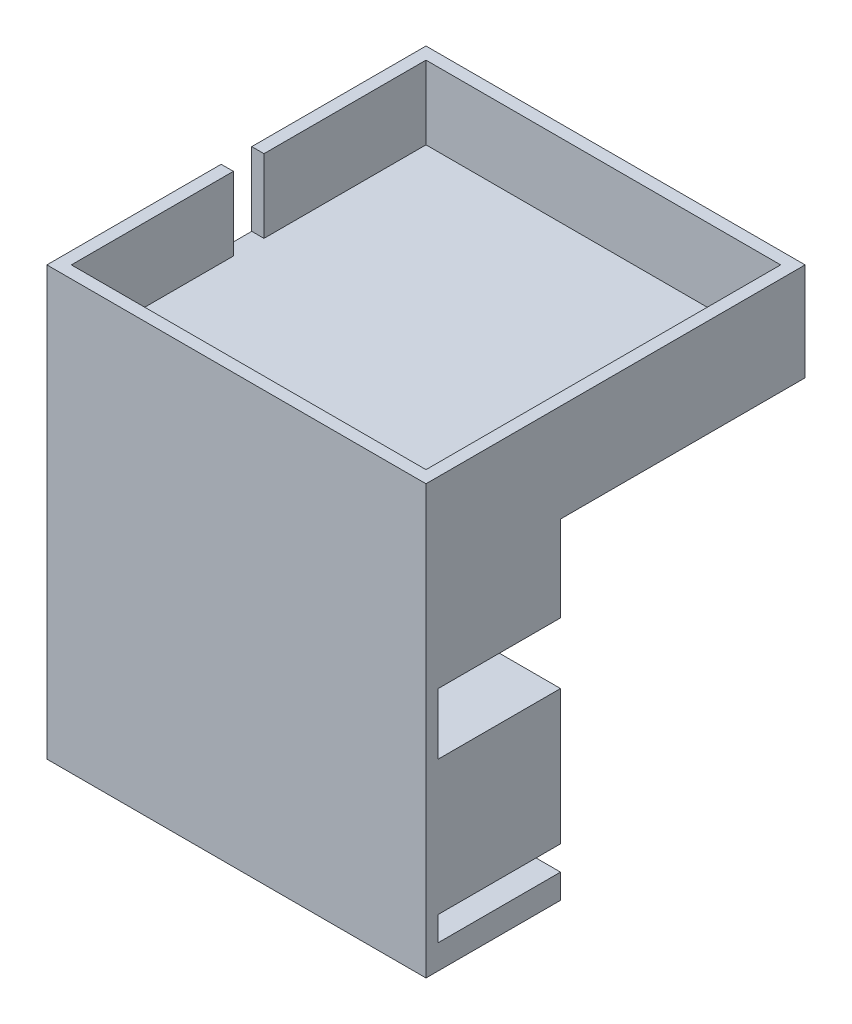
ISO-10303-21;
HEADER;
FILE_DESCRIPTION(('STEP AP214'),'2;1');
FILE_NAME('part.step','',(''),(''),'','','');
FILE_SCHEMA(('AUTOMOTIVE_DESIGN { 1 0 10303 214 1 1 1 1 }'));
ENDSEC;
DATA;
#1=APPLICATION_CONTEXT('core data for automotive mechanical design processes');
#2=APPLICATION_PROTOCOL_DEFINITION('international standard','automotive_design',2000,#1);
#3=PRODUCT_CONTEXT('',#1,'mechanical');
#4=PRODUCT('Part','Part','',(#3));
#5=PRODUCT_RELATED_PRODUCT_CATEGORY('part','',(#4));
#6=PRODUCT_DEFINITION_FORMATION('','',#4);
#7=PRODUCT_DEFINITION_CONTEXT('part definition',#1,'design');
#8=PRODUCT_DEFINITION('design','',#6,#7);
#9=PRODUCT_DEFINITION_SHAPE('','',#8);
#10=(LENGTH_UNIT() NAMED_UNIT(*) SI_UNIT(.MILLI.,.METRE.));
#11=(NAMED_UNIT(*) PLANE_ANGLE_UNIT() SI_UNIT($,.RADIAN.));
#12=(NAMED_UNIT(*) SI_UNIT($,.STERADIAN.) SOLID_ANGLE_UNIT());
#13=UNCERTAINTY_MEASURE_WITH_UNIT(LENGTH_MEASURE(1.E-05),#10,'distance_accuracy_value','');
#14=(GEOMETRIC_REPRESENTATION_CONTEXT(3) GLOBAL_UNCERTAINTY_ASSIGNED_CONTEXT((#13)) GLOBAL_UNIT_ASSIGNED_CONTEXT((#10,
#11,#12)) REPRESENTATION_CONTEXT('',''));
#15=CARTESIAN_POINT('',(0.,0.,0.));
#16=DIRECTION('',(0.,0.,1.));
#17=DIRECTION('',(1.,0.,0.));
#18=AXIS2_PLACEMENT_3D('',#15,#16,#17);
#19=CARTESIAN_POINT('',(6.5,-12.,4.5));
#20=DIRECTION('',(1.,0.,0.));
#21=DIRECTION('',(0.,0.,-1.));
#22=AXIS2_PLACEMENT_3D('',#19,#20,#21);
#23=PLANE('',#22);
#24=DIRECTION('',(0.,0.,-1.));
#25=VECTOR('',#24,1.);
#26=CARTESIAN_POINT('',(6.5,-10.,14.5));
#27=LINE('',#26,#25);
#28=CARTESIAN_POINT('',(6.5,-10.,14.5));
#29=VERTEX_POINT('',#28);
#30=CARTESIAN_POINT('',(6.5,-10.,4.5));
#31=VERTEX_POINT('',#30);
#32=EDGE_CURVE('E294',#29,#31,#27,.T.);
#33=ORIENTED_EDGE('',*,*,#32,.T.);
#34=DIRECTION('',(0.,1.,0.));
#35=VECTOR('',#34,1.);
#36=CARTESIAN_POINT('',(6.5,-12.,4.5));
#37=LINE('',#36,#35);
#38=CARTESIAN_POINT('',(6.5,-7.,4.5));
#39=VERTEX_POINT('',#38);
#40=EDGE_CURVE('E282',#31,#39,#37,.T.);
#41=ORIENTED_EDGE('',*,*,#40,.T.);
#42=DIRECTION('',(0.,0.,1.));
#43=VECTOR('',#42,1.);
#44=CARTESIAN_POINT('',(6.5,-7.,4.5));
#45=LINE('',#44,#43);
#46=CARTESIAN_POINT('',(6.5,-7.,14.5));
#47=VERTEX_POINT('',#46);
#48=EDGE_CURVE('E288',#39,#47,#45,.T.);
#49=ORIENTED_EDGE('',*,*,#48,.T.);
#50=DIRECTION('',(0.,1.,0.));
#51=VECTOR('',#50,1.);
#52=CARTESIAN_POINT('',(6.5,-12.,14.5));
#53=LINE('',#52,#51);
#54=EDGE_CURVE('E281',#29,#47,#53,.T.);
#55=ORIENTED_EDGE('',*,*,#54,.F.);
#56=EDGE_LOOP('',(#33,#41,#49,#55));
#57=FACE_BOUND('',#56,.T.);
#58=ADVANCED_FACE('F36',(#57),#23,.T.);
#59=CARTESIAN_POINT('',(0.,0.,0.));
#60=DIRECTION('',(0.,1.,0.));
#61=DIRECTION('',(0.,0.,1.));
#62=AXIS2_PLACEMENT_3D('',#59,#60,#61);
#63=PLANE('',#62);
#64=DIRECTION('',(0.,0.,-1.));
#65=VECTOR('',#64,1.);
#66=CARTESIAN_POINT('',(15.5,0.,0.));
#67=LINE('',#66,#65);
#68=CARTESIAN_POINT('',(15.5,0.,4.5));
#69=VERTEX_POINT('',#68);
#70=CARTESIAN_POINT('',(15.5,0.,-15.5));
#71=VERTEX_POINT('',#70);
#72=EDGE_CURVE('E247',#69,#71,#67,.T.);
#73=ORIENTED_EDGE('',*,*,#72,.F.);
#74=DIRECTION('',(1.,0.,0.));
#75=VECTOR('',#74,1.);
#76=CARTESIAN_POINT('',(16.5,0.,4.5));
#77=LINE('',#76,#75);
#78=CARTESIAN_POINT('',(-15.5,0.,4.5));
#79=VERTEX_POINT('',#78);
#80=EDGE_CURVE('E305',#79,#69,#77,.T.);
#81=ORIENTED_EDGE('',*,*,#80,.F.);
#82=DIRECTION('',(0.,0.,1.));
#83=VECTOR('',#82,1.);
#84=CARTESIAN_POINT('',(-15.5,0.,0.));
#85=LINE('',#84,#83);
#86=CARTESIAN_POINT('',(-15.5,0.,-15.5));
#87=VERTEX_POINT('',#86);
#88=EDGE_CURVE('E272',#87,#79,#85,.T.);
#89=ORIENTED_EDGE('',*,*,#88,.F.);
#90=DIRECTION('',(-1.,0.,0.));
#91=VECTOR('',#90,1.);
#92=CARTESIAN_POINT('',(0.,0.,-15.5));
#93=LINE('',#92,#91);
#94=EDGE_CURVE('E279',#71,#87,#93,.T.);
#95=ORIENTED_EDGE('',*,*,#94,.F.);
#96=EDGE_LOOP('',(#73,#81,#89,#95));
#97=FACE_BOUND('',#96,.T.);
#98=ADVANCED_FACE('F38',(#97),#63,.F.);
#99=CARTESIAN_POINT('',(16.5,-7.,4.5));
#100=DIRECTION('',(0.,-1.,0.));
#101=DIRECTION('',(0.,0.,-1.));
#102=AXIS2_PLACEMENT_3D('',#99,#100,#101);
#103=PLANE('',#102);
#104=DIRECTION('',(1.,0.,0.));
#105=VECTOR('',#104,1.);
#106=CARTESIAN_POINT('',(16.5,-7.,4.5));
#107=LINE('',#106,#105);
#108=CARTESIAN_POINT('',(15.5,-7.,4.5));
#109=VERTEX_POINT('',#108);
#110=EDGE_CURVE('E284',#39,#109,#107,.T.);
#111=ORIENTED_EDGE('',*,*,#110,.T.);
#112=DIRECTION('',(0.,0.,1.));
#113=VECTOR('',#112,1.);
#114=CARTESIAN_POINT('',(15.5,-7.,4.5));
#115=LINE('',#114,#113);
#116=CARTESIAN_POINT('',(15.5,-7.,14.5));
#117=VERTEX_POINT('',#116);
#118=EDGE_CURVE('E44',#109,#117,#115,.T.);
#119=ORIENTED_EDGE('',*,*,#118,.T.);
#120=DIRECTION('',(1.,0.,0.));
#121=VECTOR('',#120,1.);
#122=CARTESIAN_POINT('',(16.5,-7.,14.5));
#123=LINE('',#122,#121);
#124=EDGE_CURVE('E285',#47,#117,#123,.T.);
#125=ORIENTED_EDGE('',*,*,#124,.F.);
#126=ORIENTED_EDGE('',*,*,#48,.F.);
#127=EDGE_LOOP('',(#111,#119,#125,#126));
#128=FACE_BOUND('',#127,.T.);
#129=ADVANCED_FACE('F373',(#128),#103,.T.);
#130=CARTESIAN_POINT('',(0.,0.,14.5));
#131=DIRECTION('',(0.,0.,-1.));
#132=DIRECTION('',(-1.,0.,0.));
#133=AXIS2_PLACEMENT_3D('',#130,#131,#132);
#134=PLANE('',#133);
#135=ORIENTED_EDGE('',*,*,#124,.T.);
#136=DIRECTION('',(0.,-1.,0.));
#137=VECTOR('',#136,1.);
#138=CARTESIAN_POINT('',(15.5,0.,14.5));
#139=LINE('',#138,#137);
#140=CARTESIAN_POINT('',(15.5,-12.,14.5));
#141=VERTEX_POINT('',#140);
#142=EDGE_CURVE('E59',#117,#141,#139,.T.);
#143=ORIENTED_EDGE('',*,*,#142,.T.);
#144=DIRECTION('',(-1.,0.,0.));
#145=VECTOR('',#144,1.);
#146=CARTESIAN_POINT('',(16.5,-12.,14.5));
#147=LINE('',#146,#145);
#148=CARTESIAN_POINT('',(-15.5,-12.,14.5));
#149=VERTEX_POINT('',#148);
#150=EDGE_CURVE('E312',#141,#149,#147,.T.);
#151=ORIENTED_EDGE('',*,*,#150,.T.);
#152=DIRECTION('',(0.,1.,0.));
#153=VECTOR('',#152,1.);
#154=CARTESIAN_POINT('',(-15.5,0.,14.5));
#155=LINE('',#154,#153);
#156=CARTESIAN_POINT('',(-15.5,-10.,14.5));
#157=VERTEX_POINT('',#156);
#158=EDGE_CURVE('E265',#149,#157,#155,.T.);
#159=ORIENTED_EDGE('',*,*,#158,.T.);
#160=DIRECTION('',(1.,0.,0.));
#161=VECTOR('',#160,1.);
#162=CARTESIAN_POINT('',(16.5,-10.,14.5));
#163=LINE('',#162,#161);
#164=EDGE_CURVE('E309',#157,#29,#163,.T.);
#165=ORIENTED_EDGE('',*,*,#164,.T.);
#166=ORIENTED_EDGE('',*,*,#54,.T.);
#167=EDGE_LOOP('',(#135,#143,#151,#159,#165,#166));
#168=FACE_BOUND('',#167,.T.);
#169=ADVANCED_FACE('F378',(#168),#134,.T.);
#170=CARTESIAN_POINT('',(16.5,-12.,14.5));
#171=DIRECTION('',(0.,-1.,0.));
#172=DIRECTION('',(0.,0.,-1.));
#173=AXIS2_PLACEMENT_3D('',#170,#171,#172);
#174=PLANE('',#173);
#175=DIRECTION('',(0.,0.,1.));
#176=VECTOR('',#175,1.);
#177=CARTESIAN_POINT('',(15.5,-12.,14.5));
#178=LINE('',#177,#176);
#179=CARTESIAN_POINT('',(15.5,-12.,4.5));
#180=VERTEX_POINT('',#179);
#181=EDGE_CURVE('E239',#180,#141,#178,.T.);
#182=ORIENTED_EDGE('',*,*,#181,.F.);
#183=DIRECTION('',(-1.,0.,0.));
#184=VECTOR('',#183,1.);
#185=CARTESIAN_POINT('',(16.5,-12.,4.5));
#186=LINE('',#185,#184);
#187=CARTESIAN_POINT('',(-15.5,-12.,4.5));
#188=VERTEX_POINT('',#187);
#189=EDGE_CURVE('E297',#180,#188,#186,.T.);
#190=ORIENTED_EDGE('',*,*,#189,.T.);
#191=DIRECTION('',(0.,0.,-1.));
#192=VECTOR('',#191,1.);
#193=CARTESIAN_POINT('',(-15.5,-12.,14.5));
#194=LINE('',#193,#192);
#195=EDGE_CURVE('E263',#149,#188,#194,.T.);
#196=ORIENTED_EDGE('',*,*,#195,.F.);
#197=ORIENTED_EDGE('',*,*,#150,.F.);
#198=EDGE_LOOP('',(#182,#190,#196,#197));
#199=FACE_BOUND('',#198,.T.);
#200=ADVANCED_FACE('F431',(#199),#174,.F.);
#201=CARTESIAN_POINT('',(0.,0.,14.5));
#202=DIRECTION('',(0.,0.,-1.));
#203=DIRECTION('',(-1.,0.,0.));
#204=AXIS2_PLACEMENT_3D('',#201,#202,#203);
#205=PLANE('',#204);
#206=DIRECTION('',(1.,0.,0.));
#207=VECTOR('',#206,1.);
#208=CARTESIAN_POINT('',(16.5,-23.,14.5));
#209=LINE('',#208,#207);
#210=CARTESIAN_POINT('',(-15.5,-23.,14.5));
#211=VERTEX_POINT('',#210);
#212=CARTESIAN_POINT('',(15.5,-23.,14.5));
#213=VERTEX_POINT('',#212);
#214=EDGE_CURVE('E301',#211,#213,#209,.T.);
#215=ORIENTED_EDGE('',*,*,#214,.T.);
#216=DIRECTION('',(0.,-1.,0.));
#217=VECTOR('',#216,1.);
#218=CARTESIAN_POINT('',(15.5,0.,14.5));
#219=LINE('',#218,#217);
#220=CARTESIAN_POINT('',(15.5,-25.,14.5));
#221=VERTEX_POINT('',#220);
#222=EDGE_CURVE('E249',#213,#221,#219,.T.);
#223=ORIENTED_EDGE('',*,*,#222,.T.);
#224=DIRECTION('',(-1.,0.,0.));
#225=VECTOR('',#224,1.);
#226=CARTESIAN_POINT('',(16.5,-25.,14.5));
#227=LINE('',#226,#225);
#228=CARTESIAN_POINT('',(-15.5,-25.,14.5));
#229=VERTEX_POINT('',#228);
#230=EDGE_CURVE('E298',#221,#229,#227,.T.);
#231=ORIENTED_EDGE('',*,*,#230,.T.);
#232=DIRECTION('',(0.,1.,0.));
#233=VECTOR('',#232,1.);
#234=CARTESIAN_POINT('',(-15.5,0.,14.5));
#235=LINE('',#234,#233);
#236=EDGE_CURVE('E11',#229,#211,#235,.T.);
#237=ORIENTED_EDGE('',*,*,#236,.T.);
#238=EDGE_LOOP('',(#215,#223,#231,#237));
#239=FACE_BOUND('',#238,.T.);
#240=ADVANCED_FACE('F417',(#239),#205,.T.);
#241=CARTESIAN_POINT('',(16.5,-25.,14.5));
#242=DIRECTION('',(0.,-1.,0.));
#243=DIRECTION('',(0.,0.,-1.));
#244=AXIS2_PLACEMENT_3D('',#241,#242,#243);
#245=PLANE('',#244);
#246=DIRECTION('',(0.,0.,1.));
#247=VECTOR('',#246,1.);
#248=CARTESIAN_POINT('',(15.5,-25.,14.5));
#249=LINE('',#248,#247);
#250=CARTESIAN_POINT('',(15.5,-25.,4.5));
#251=VERTEX_POINT('',#250);
#252=EDGE_CURVE('E252',#251,#221,#249,.T.);
#253=ORIENTED_EDGE('',*,*,#252,.F.);
#254=DIRECTION('',(-1.,0.,0.));
#255=VECTOR('',#254,1.);
#256=CARTESIAN_POINT('',(16.5,-25.,4.5));
#257=LINE('',#256,#255);
#258=CARTESIAN_POINT('',(-15.5,-25.,4.5));
#259=VERTEX_POINT('',#258);
#260=EDGE_CURVE('E306',#251,#259,#257,.T.);
#261=ORIENTED_EDGE('',*,*,#260,.T.);
#262=DIRECTION('',(0.,0.,-1.));
#263=VECTOR('',#262,1.);
#264=CARTESIAN_POINT('',(-15.5,-25.,14.5));
#265=LINE('',#264,#263);
#266=EDGE_CURVE('E256',#229,#259,#265,.T.);
#267=ORIENTED_EDGE('',*,*,#266,.F.);
#268=ORIENTED_EDGE('',*,*,#230,.F.);
#269=EDGE_LOOP('',(#253,#261,#267,#268));
#270=FACE_BOUND('',#269,.T.);
#271=ADVANCED_FACE('F413',(#270),#245,.F.);
#272=CARTESIAN_POINT('',(16.5,-23.,14.5));
#273=DIRECTION('',(0.,1.,0.));
#274=DIRECTION('',(0.,0.,1.));
#275=AXIS2_PLACEMENT_3D('',#272,#273,#274);
#276=PLANE('',#275);
#277=DIRECTION('',(0.,0.,-1.));
#278=VECTOR('',#277,1.);
#279=CARTESIAN_POINT('',(15.5,-23.,14.5));
#280=LINE('',#279,#278);
#281=CARTESIAN_POINT('',(15.5,-23.,4.5));
#282=VERTEX_POINT('',#281);
#283=EDGE_CURVE('E245',#213,#282,#280,.T.);
#284=ORIENTED_EDGE('',*,*,#283,.F.);
#285=ORIENTED_EDGE('',*,*,#214,.F.);
#286=DIRECTION('',(0.,0.,1.));
#287=VECTOR('',#286,1.);
#288=CARTESIAN_POINT('',(-15.5,-23.,14.5));
#289=LINE('',#288,#287);
#290=CARTESIAN_POINT('',(-15.5,-23.,4.5));
#291=VERTEX_POINT('',#290);
#292=EDGE_CURVE('E258',#291,#211,#289,.T.);
#293=ORIENTED_EDGE('',*,*,#292,.F.);
#294=DIRECTION('',(1.,0.,0.));
#295=VECTOR('',#294,1.);
#296=CARTESIAN_POINT('',(16.5,-23.,4.5));
#297=LINE('',#296,#295);
#298=EDGE_CURVE('E302',#291,#282,#297,.T.);
#299=ORIENTED_EDGE('',*,*,#298,.T.);
#300=EDGE_LOOP('',(#284,#285,#293,#299));
#301=FACE_BOUND('',#300,.T.);
#302=ADVANCED_FACE('F421',(#301),#276,.F.);
#303=CARTESIAN_POINT('',(0.,-27.,0.));
#304=DIRECTION('',(0.,1.,0.));
#305=DIRECTION('',(0.,0.,1.));
#306=AXIS2_PLACEMENT_3D('',#303,#304,#305);
#307=PLANE('',#306);
#308=DIRECTION('',(0.,0.,-1.));
#309=VECTOR('',#308,1.);
#310=CARTESIAN_POINT('',(15.5,-27.,15.5));
#311=LINE('',#310,#309);
#312=CARTESIAN_POINT('',(15.5,-27.,15.5));
#313=VERTEX_POINT('',#312);
#314=CARTESIAN_POINT('',(15.5,-27.,4.5));
#315=VERTEX_POINT('',#314);
#316=EDGE_CURVE('E207',#313,#315,#311,.T.);
#317=ORIENTED_EDGE('',*,*,#316,.F.);
#318=DIRECTION('',(1.,0.,0.));
#319=VECTOR('',#318,1.);
#320=CARTESIAN_POINT('',(15.5,-27.,15.5));
#321=LINE('',#320,#319);
#322=CARTESIAN_POINT('',(-15.5,-27.,15.5));
#323=VERTEX_POINT('',#322);
#324=EDGE_CURVE('E206',#323,#313,#321,.T.);
#325=ORIENTED_EDGE('',*,*,#324,.F.);
#326=DIRECTION('',(0.,0.,1.));
#327=VECTOR('',#326,1.);
#328=CARTESIAN_POINT('',(-15.5,-27.,15.5));
#329=LINE('',#328,#327);
#330=CARTESIAN_POINT('',(-15.5,-27.,4.5));
#331=VERTEX_POINT('',#330);
#332=EDGE_CURVE('E195',#331,#323,#329,.T.);
#333=ORIENTED_EDGE('',*,*,#332,.F.);
#334=DIRECTION('',(1.,0.,0.));
#335=VECTOR('',#334,1.);
#336=CARTESIAN_POINT('',(16.5,-27.,4.5));
#337=LINE('',#336,#335);
#338=EDGE_CURVE('E320',#331,#315,#337,.T.);
#339=ORIENTED_EDGE('',*,*,#338,.T.);
#340=EDGE_LOOP('',(#317,#325,#333,#339));
#341=FACE_BOUND('',#340,.T.);
#342=ADVANCED_FACE('F219',(#341),#307,.F.);
#343=CARTESIAN_POINT('',(16.5,-27.,4.5));
#344=DIRECTION('',(0.,0.,1.));
#345=DIRECTION('',(1.,0.,0.));
#346=AXIS2_PLACEMENT_3D('',#343,#344,#345);
#347=PLANE('',#346);
#348=DIRECTION('',(0.,1.,0.));
#349=VECTOR('',#348,1.);
#350=CARTESIAN_POINT('',(15.5,-27.,4.5));
#351=LINE('',#350,#349);
#352=EDGE_CURVE('E254',#315,#251,#351,.T.);
#353=ORIENTED_EDGE('',*,*,#352,.F.);
#354=ORIENTED_EDGE('',*,*,#338,.F.);
#355=DIRECTION('',(0.,-1.,0.));
#356=VECTOR('',#355,1.);
#357=CARTESIAN_POINT('',(-15.5,-27.,4.5));
#358=LINE('',#357,#356);
#359=EDGE_CURVE('E201',#259,#331,#358,.T.);
#360=ORIENTED_EDGE('',*,*,#359,.F.);
#361=ORIENTED_EDGE('',*,*,#260,.F.);
#362=EDGE_LOOP('',(#353,#354,#360,#361));
#363=FACE_BOUND('',#362,.T.);
#364=ADVANCED_FACE('F410',(#363),#347,.F.);
#365=DIRECTION('',(0.,1.,0.));
#366=VECTOR('',#365,1.);
#367=CARTESIAN_POINT('',(15.5,-27.,4.5));
#368=LINE('',#367,#366);
#369=EDGE_CURVE('E241',#282,#180,#368,.T.);
#370=ORIENTED_EDGE('',*,*,#369,.F.);
#371=ORIENTED_EDGE('',*,*,#298,.F.);
#372=DIRECTION('',(0.,-1.,0.));
#373=VECTOR('',#372,1.);
#374=CARTESIAN_POINT('',(-15.5,-27.,4.5));
#375=LINE('',#374,#373);
#376=EDGE_CURVE('E261',#188,#291,#375,.T.);
#377=ORIENTED_EDGE('',*,*,#376,.F.);
#378=ORIENTED_EDGE('',*,*,#189,.F.);
#379=EDGE_LOOP('',(#370,#371,#377,#378));
#380=FACE_BOUND('',#379,.T.);
#381=ADVANCED_FACE('F427',(#380),#347,.F.);
#382=CARTESIAN_POINT('',(16.5,-10.,14.5));
#383=DIRECTION('',(0.,1.,0.));
#384=DIRECTION('',(-1.,0.,0.));
#385=AXIS2_PLACEMENT_3D('',#382,#383,#384);
#386=PLANE('',#385);
#387=DIRECTION('',(0.,0.,1.));
#388=VECTOR('',#387,1.);
#389=CARTESIAN_POINT('',(-15.5,-10.,14.5));
#390=LINE('',#389,#388);
#391=CARTESIAN_POINT('',(-15.5,-10.,4.5));
#392=VERTEX_POINT('',#391);
#393=EDGE_CURVE('E268',#392,#157,#390,.T.);
#394=ORIENTED_EDGE('',*,*,#393,.F.);
#395=DIRECTION('',(1.,0.,0.));
#396=VECTOR('',#395,1.);
#397=CARTESIAN_POINT('',(16.5,-10.,4.5));
#398=LINE('',#397,#396);
#399=EDGE_CURVE('E315',#392,#31,#398,.T.);
#400=ORIENTED_EDGE('',*,*,#399,.T.);
#401=ORIENTED_EDGE('',*,*,#32,.F.);
#402=ORIENTED_EDGE('',*,*,#164,.F.);
#403=EDGE_LOOP('',(#394,#400,#401,#402));
#404=FACE_BOUND('',#403,.T.);
#405=ADVANCED_FACE('F434',(#404),#386,.F.);
#406=DIRECTION('',(0.,1.,0.));
#407=VECTOR('',#406,1.);
#408=CARTESIAN_POINT('',(15.5,-27.,4.5));
#409=LINE('',#408,#407);
#410=EDGE_CURVE('E243',#109,#69,#409,.T.);
#411=ORIENTED_EDGE('',*,*,#410,.F.);
#412=ORIENTED_EDGE('',*,*,#110,.F.);
#413=ORIENTED_EDGE('',*,*,#40,.F.);
#414=ORIENTED_EDGE('',*,*,#399,.F.);
#415=DIRECTION('',(0.,-1.,0.));
#416=VECTOR('',#415,1.);
#417=CARTESIAN_POINT('',(-15.5,-27.,4.5));
#418=LINE('',#417,#416);
#419=EDGE_CURVE('E270',#79,#392,#418,.T.);
#420=ORIENTED_EDGE('',*,*,#419,.F.);
#421=ORIENTED_EDGE('',*,*,#80,.T.);
#422=EDGE_LOOP('',(#411,#412,#413,#414,#420,#421));
#423=FACE_BOUND('',#422,.T.);
#424=ADVANCED_FACE('F386',(#423),#347,.F.);
#425=CARTESIAN_POINT('',(15.5,-27.,-15.5));
#426=DIRECTION('',(0.,0.,-1.));
#427=DIRECTION('',(-1.,0.,0.));
#428=AXIS2_PLACEMENT_3D('',#425,#426,#427);
#429=PLANE('',#428);
#430=ORIENTED_EDGE('',*,*,#94,.T.);
#431=DIRECTION('',(0.,1.,0.));
#432=VECTOR('',#431,1.);
#433=CARTESIAN_POINT('',(-15.5,-27.,-15.5));
#434=LINE('',#433,#432);
#435=CARTESIAN_POINT('',(-15.5,8.,-15.5));
#436=VERTEX_POINT('',#435);
#437=EDGE_CURVE('E217',#87,#436,#434,.T.);
#438=ORIENTED_EDGE('',*,*,#437,.T.);
#439=DIRECTION('',(-1.,0.,0.));
#440=VECTOR('',#439,1.);
#441=CARTESIAN_POINT('',(15.5,8.,-15.5));
#442=LINE('',#441,#440);
#443=CARTESIAN_POINT('',(15.5,8.,-15.5));
#444=VERTEX_POINT('',#443);
#445=EDGE_CURVE('E228',#444,#436,#442,.T.);
#446=ORIENTED_EDGE('',*,*,#445,.F.);
#447=DIRECTION('',(0.,1.,0.));
#448=VECTOR('',#447,1.);
#449=CARTESIAN_POINT('',(15.5,-27.,-15.5));
#450=LINE('',#449,#448);
#451=EDGE_CURVE('E220',#71,#444,#450,.T.);
#452=ORIENTED_EDGE('',*,*,#451,.F.);
#453=EDGE_LOOP('',(#430,#438,#446,#452));
#454=FACE_BOUND('',#453,.T.);
#455=ADVANCED_FACE('F398',(#454),#429,.T.);
#456=CARTESIAN_POINT('',(-15.5,-27.,15.5));
#457=DIRECTION('',(-1.,0.,0.));
#458=DIRECTION('',(0.,0.,1.));
#459=AXIS2_PLACEMENT_3D('',#456,#457,#458);
#460=PLANE('',#459);
#461=DIRECTION('',(0.,-1.,0.));
#462=VECTOR('',#461,1.);
#463=CARTESIAN_POINT('',(-15.5,2.,1.25));
#464=LINE('',#463,#462);
#465=CARTESIAN_POINT('',(-15.5,8.,1.25));
#466=VERTEX_POINT('',#465);
#467=CARTESIAN_POINT('',(-15.5,2.,1.25));
#468=VERTEX_POINT('',#467);
#469=EDGE_CURVE('E277',#466,#468,#464,.T.);
#470=ORIENTED_EDGE('',*,*,#469,.T.);
#471=DIRECTION('',(0.,0.,1.));
#472=VECTOR('',#471,1.);
#473=CARTESIAN_POINT('',(-15.5,2.,0.));
#474=LINE('',#473,#472);
#475=CARTESIAN_POINT('',(-15.5,2.,-1.25));
#476=VERTEX_POINT('',#475);
#477=EDGE_CURVE('E51',#476,#468,#474,.T.);
#478=ORIENTED_EDGE('',*,*,#477,.F.);
#479=DIRECTION('',(0.,1.,0.));
#480=VECTOR('',#479,1.);
#481=CARTESIAN_POINT('',(-15.5,2.,-1.25));
#482=LINE('',#481,#480);
#483=CARTESIAN_POINT('',(-15.5,8.,-1.25));
#484=VERTEX_POINT('',#483);
#485=EDGE_CURVE('E274',#476,#484,#482,.T.);
#486=ORIENTED_EDGE('',*,*,#485,.T.);
#487=DIRECTION('',(0.,0.,1.));
#488=VECTOR('',#487,1.);
#489=CARTESIAN_POINT('',(-15.5,8.,15.5));
#490=LINE('',#489,#488);
#491=EDGE_CURVE('E232',#436,#484,#490,.T.);
#492=ORIENTED_EDGE('',*,*,#491,.F.);
#493=ORIENTED_EDGE('',*,*,#437,.F.);
#494=ORIENTED_EDGE('',*,*,#88,.T.);
#495=ORIENTED_EDGE('',*,*,#419,.T.);
#496=ORIENTED_EDGE('',*,*,#393,.T.);
#497=ORIENTED_EDGE('',*,*,#158,.F.);
#498=ORIENTED_EDGE('',*,*,#195,.T.);
#499=ORIENTED_EDGE('',*,*,#376,.T.);
#500=ORIENTED_EDGE('',*,*,#292,.T.);
#501=ORIENTED_EDGE('',*,*,#236,.F.);
#502=ORIENTED_EDGE('',*,*,#266,.T.);
#503=ORIENTED_EDGE('',*,*,#359,.T.);
#504=ORIENTED_EDGE('',*,*,#332,.T.);
#505=DIRECTION('',(0.,1.,0.));
#506=VECTOR('',#505,1.);
#507=CARTESIAN_POINT('',(-15.5,-27.,15.5));
#508=LINE('',#507,#506);
#509=CARTESIAN_POINT('',(-15.5,8.,15.5));
#510=VERTEX_POINT('',#509);
#511=EDGE_CURVE('E198',#323,#510,#508,.T.);
#512=ORIENTED_EDGE('',*,*,#511,.T.);
#513=EDGE_CURVE('E231',#466,#510,#490,.T.);
#514=ORIENTED_EDGE('',*,*,#513,.F.);
#515=EDGE_LOOP('',(#470,#478,#486,#492,#493,#494,#495,#496,#497,#498,#499,#500,#501,#502,#503,
#504,#512,#514));
#516=FACE_BOUND('',#515,.T.);
#517=ADVANCED_FACE('F197',(#516),#460,.T.);
#518=CARTESIAN_POINT('',(15.5,-27.,15.5));
#519=DIRECTION('',(1.,0.,0.));
#520=DIRECTION('',(0.,0.,-1.));
#521=AXIS2_PLACEMENT_3D('',#518,#519,#520);
#522=PLANE('',#521);
#523=ORIENTED_EDGE('',*,*,#352,.T.);
#524=ORIENTED_EDGE('',*,*,#252,.T.);
#525=ORIENTED_EDGE('',*,*,#222,.F.);
#526=ORIENTED_EDGE('',*,*,#283,.T.);
#527=ORIENTED_EDGE('',*,*,#369,.T.);
#528=ORIENTED_EDGE('',*,*,#181,.T.);
#529=ORIENTED_EDGE('',*,*,#142,.F.);
#530=ORIENTED_EDGE('',*,*,#118,.F.);
#531=ORIENTED_EDGE('',*,*,#410,.T.);
#532=ORIENTED_EDGE('',*,*,#72,.T.);
#533=ORIENTED_EDGE('',*,*,#451,.T.);
#534=DIRECTION('',(0.,0.,-1.));
#535=VECTOR('',#534,1.);
#536=CARTESIAN_POINT('',(15.5,8.,15.5));
#537=LINE('',#536,#535);
#538=CARTESIAN_POINT('',(15.5,8.,15.5));
#539=VERTEX_POINT('',#538);
#540=EDGE_CURVE('E225',#539,#444,#537,.T.);
#541=ORIENTED_EDGE('',*,*,#540,.F.);
#542=DIRECTION('',(0.,1.,0.));
#543=VECTOR('',#542,1.);
#544=CARTESIAN_POINT('',(15.5,-27.,15.5));
#545=LINE('',#544,#543);
#546=EDGE_CURVE('E216',#313,#539,#545,.T.);
#547=ORIENTED_EDGE('',*,*,#546,.F.);
#548=ORIENTED_EDGE('',*,*,#316,.T.);
#549=EDGE_LOOP('',(#523,#524,#525,#526,#527,#528,#529,#530,#531,#532,#533,#541,#547,#548));
#550=FACE_BOUND('',#549,.T.);
#551=ADVANCED_FACE('F391',(#550),#522,.T.);
#552=CARTESIAN_POINT('',(15.5,-27.,15.5));
#553=DIRECTION('',(0.,0.,1.));
#554=DIRECTION('',(1.,0.,0.));
#555=AXIS2_PLACEMENT_3D('',#552,#553,#554);
#556=PLANE('',#555);
#557=DIRECTION('',(1.,0.,0.));
#558=VECTOR('',#557,1.);
#559=CARTESIAN_POINT('',(15.5,8.,15.5));
#560=LINE('',#559,#558);
#561=EDGE_CURVE('E214',#510,#539,#560,.T.);
#562=ORIENTED_EDGE('',*,*,#561,.F.);
#563=ORIENTED_EDGE('',*,*,#511,.F.);
#564=ORIENTED_EDGE('',*,*,#324,.T.);
#565=ORIENTED_EDGE('',*,*,#546,.T.);
#566=EDGE_LOOP('',(#562,#563,#564,#565));
#567=FACE_BOUND('',#566,.T.);
#568=ADVANCED_FACE('F211',(#567),#556,.T.);
#569=CARTESIAN_POINT('',(0.,8.,0.));
#570=DIRECTION('',(0.,1.,0.));
#571=DIRECTION('',(0.,0.,1.));
#572=AXIS2_PLACEMENT_3D('',#569,#570,#571);
#573=PLANE('',#572);
#574=DIRECTION('',(1.,0.,0.));
#575=VECTOR('',#574,1.);
#576=CARTESIAN_POINT('',(-17.8456799265776,8.,1.25));
#577=LINE('',#576,#575);
#578=CARTESIAN_POINT('',(-14.5,8.,1.25));
#579=VERTEX_POINT('',#578);
#580=EDGE_CURVE('E329',#466,#579,#577,.T.);
#581=ORIENTED_EDGE('',*,*,#580,.F.);
#582=ORIENTED_EDGE('',*,*,#513,.T.);
#583=ORIENTED_EDGE('',*,*,#561,.T.);
#584=ORIENTED_EDGE('',*,*,#540,.T.);
#585=ORIENTED_EDGE('',*,*,#445,.T.);
#586=ORIENTED_EDGE('',*,*,#491,.T.);
#587=DIRECTION('',(-1.,0.,0.));
#588=VECTOR('',#587,1.);
#589=CARTESIAN_POINT('',(-17.8456799265776,8.,-1.25));
#590=LINE('',#589,#588);
#591=CARTESIAN_POINT('',(-14.5,8.,-1.25));
#592=VERTEX_POINT('',#591);
#593=EDGE_CURVE('E322',#592,#484,#590,.T.);
#594=ORIENTED_EDGE('',*,*,#593,.F.);
#595=DIRECTION('',(0.,0.,1.));
#596=VECTOR('',#595,1.);
#597=CARTESIAN_POINT('',(-14.5,8.,-16.5));
#598=LINE('',#597,#596);
#599=CARTESIAN_POINT('',(-14.5,8.,-14.5));
#600=VERTEX_POINT('',#599);
#601=EDGE_CURVE('E368',#600,#592,#598,.T.);
#602=ORIENTED_EDGE('',*,*,#601,.F.);
#603=DIRECTION('',(-1.,0.,0.));
#604=VECTOR('',#603,1.);
#605=CARTESIAN_POINT('',(-16.5,8.,-14.5));
#606=LINE('',#605,#604);
#607=CARTESIAN_POINT('',(14.5,8.,-14.5));
#608=VERTEX_POINT('',#607);
#609=EDGE_CURVE('E365',#608,#600,#606,.T.);
#610=ORIENTED_EDGE('',*,*,#609,.F.);
#611=DIRECTION('',(0.,0.,-1.));
#612=VECTOR('',#611,1.);
#613=CARTESIAN_POINT('',(14.5,8.,-16.5));
#614=LINE('',#613,#612);
#615=CARTESIAN_POINT('',(14.5,8.,14.5));
#616=VERTEX_POINT('',#615);
#617=EDGE_CURVE('E363',#616,#608,#614,.T.);
#618=ORIENTED_EDGE('',*,*,#617,.F.);
#619=DIRECTION('',(1.,0.,0.));
#620=VECTOR('',#619,1.);
#621=CARTESIAN_POINT('',(-16.5,8.,14.5));
#622=LINE('',#621,#620);
#623=CARTESIAN_POINT('',(-14.5,8.,14.5));
#624=VERTEX_POINT('',#623);
#625=EDGE_CURVE('E351',#624,#616,#622,.T.);
#626=ORIENTED_EDGE('',*,*,#625,.F.);
#627=EDGE_CURVE('E367',#579,#624,#598,.T.);
#628=ORIENTED_EDGE('',*,*,#627,.F.);
#629=EDGE_LOOP('',(#581,#582,#583,#584,#585,#586,#594,#602,#610,#618,#626,#628));
#630=FACE_BOUND('',#629,.T.);
#631=ADVANCED_FACE('F404',(#630),#573,.T.);
#632=CARTESIAN_POINT('',(0.,2.,0.));
#633=DIRECTION('',(0.,1.,0.));
#634=DIRECTION('',(0.,0.,1.));
#635=AXIS2_PLACEMENT_3D('',#632,#633,#634);
#636=PLANE('',#635);
#637=DIRECTION('',(-1.,0.,0.));
#638=VECTOR('',#637,1.);
#639=CARTESIAN_POINT('',(-17.8456799265776,2.,-1.25));
#640=LINE('',#639,#638);
#641=CARTESIAN_POINT('',(-14.5,2.,-1.25));
#642=VERTEX_POINT('',#641);
#643=EDGE_CURVE('E325',#642,#476,#640,.T.);
#644=ORIENTED_EDGE('',*,*,#643,.T.);
#645=ORIENTED_EDGE('',*,*,#477,.T.);
#646=DIRECTION('',(1.,0.,0.));
#647=VECTOR('',#646,1.);
#648=CARTESIAN_POINT('',(-17.8456799265776,2.,1.25));
#649=LINE('',#648,#647);
#650=CARTESIAN_POINT('',(-14.5,2.,1.25));
#651=VERTEX_POINT('',#650);
#652=EDGE_CURVE('E328',#468,#651,#649,.T.);
#653=ORIENTED_EDGE('',*,*,#652,.T.);
#654=DIRECTION('',(0.,0.,1.));
#655=VECTOR('',#654,1.);
#656=CARTESIAN_POINT('',(-14.5,2.,-16.5));
#657=LINE('',#656,#655);
#658=CARTESIAN_POINT('',(-14.5,2.,14.5));
#659=VERTEX_POINT('',#658);
#660=EDGE_CURVE('E353',#651,#659,#657,.T.);
#661=ORIENTED_EDGE('',*,*,#660,.T.);
#662=DIRECTION('',(1.,0.,0.));
#663=VECTOR('',#662,1.);
#664=CARTESIAN_POINT('',(-16.5,2.,14.5));
#665=LINE('',#664,#663);
#666=CARTESIAN_POINT('',(14.5,2.,14.5));
#667=VERTEX_POINT('',#666);
#668=EDGE_CURVE('E359',#659,#667,#665,.T.);
#669=ORIENTED_EDGE('',*,*,#668,.T.);
#670=DIRECTION('',(0.,0.,-1.));
#671=VECTOR('',#670,1.);
#672=CARTESIAN_POINT('',(14.5,2.,-16.5));
#673=LINE('',#672,#671);
#674=CARTESIAN_POINT('',(14.5,2.,-14.5));
#675=VERTEX_POINT('',#674);
#676=EDGE_CURVE('E339',#667,#675,#673,.T.);
#677=ORIENTED_EDGE('',*,*,#676,.T.);
#678=DIRECTION('',(-1.,0.,0.));
#679=VECTOR('',#678,1.);
#680=CARTESIAN_POINT('',(-16.5,2.,-14.5));
#681=LINE('',#680,#679);
#682=CARTESIAN_POINT('',(-14.5,2.,-14.5));
#683=VERTEX_POINT('',#682);
#684=EDGE_CURVE('E342',#675,#683,#681,.T.);
#685=ORIENTED_EDGE('',*,*,#684,.T.);
#686=EDGE_CURVE('E356',#683,#642,#657,.T.);
#687=ORIENTED_EDGE('',*,*,#686,.T.);
#688=EDGE_LOOP('',(#644,#645,#653,#661,#669,#677,#685,#687));
#689=FACE_BOUND('',#688,.T.);
#690=ADVANCED_FACE('F533',(#689),#636,.T.);
#691=CARTESIAN_POINT('',(-17.8456799265776,2.,1.25));
#692=DIRECTION('',(0.,0.,1.));
#693=DIRECTION('',(1.,0.,0.));
#694=AXIS2_PLACEMENT_3D('',#691,#692,#693);
#695=PLANE('',#694);
#696=ORIENTED_EDGE('',*,*,#469,.F.);
#697=ORIENTED_EDGE('',*,*,#580,.T.);
#698=DIRECTION('',(0.,-1.,0.));
#699=VECTOR('',#698,1.);
#700=CARTESIAN_POINT('',(-14.5,8.,1.25));
#701=LINE('',#700,#699);
#702=EDGE_CURVE('E336',#579,#651,#701,.T.);
#703=ORIENTED_EDGE('',*,*,#702,.T.);
#704=ORIENTED_EDGE('',*,*,#652,.F.);
#705=EDGE_LOOP('',(#696,#697,#703,#704));
#706=FACE_BOUND('',#705,.T.);
#707=ADVANCED_FACE('F535',(#706),#695,.F.);
#708=CARTESIAN_POINT('',(-17.8456799265776,2.,-1.25));
#709=DIRECTION('',(0.,0.,-1.));
#710=DIRECTION('',(-1.,0.,0.));
#711=AXIS2_PLACEMENT_3D('',#708,#709,#710);
#712=PLANE('',#711);
#713=ORIENTED_EDGE('',*,*,#485,.F.);
#714=ORIENTED_EDGE('',*,*,#643,.F.);
#715=DIRECTION('',(0.,1.,0.));
#716=VECTOR('',#715,1.);
#717=CARTESIAN_POINT('',(-14.5,8.,-1.25));
#718=LINE('',#717,#716);
#719=EDGE_CURVE('E331',#642,#592,#718,.T.);
#720=ORIENTED_EDGE('',*,*,#719,.T.);
#721=ORIENTED_EDGE('',*,*,#593,.T.);
#722=EDGE_LOOP('',(#713,#714,#720,#721));
#723=FACE_BOUND('',#722,.T.);
#724=ADVANCED_FACE('F502',(#723),#712,.F.);
#725=CARTESIAN_POINT('',(-14.5,8.,-16.5));
#726=DIRECTION('',(1.,0.,0.));
#727=DIRECTION('',(0.,0.,-1.));
#728=AXIS2_PLACEMENT_3D('',#725,#726,#727);
#729=PLANE('',#728);
#730=ORIENTED_EDGE('',*,*,#702,.F.);
#731=ORIENTED_EDGE('',*,*,#627,.T.);
#732=DIRECTION('',(0.,-1.,0.));
#733=VECTOR('',#732,1.);
#734=CARTESIAN_POINT('',(-14.5,8.,14.5));
#735=LINE('',#734,#733);
#736=EDGE_CURVE('E350',#624,#659,#735,.T.);
#737=ORIENTED_EDGE('',*,*,#736,.T.);
#738=ORIENTED_EDGE('',*,*,#660,.F.);
#739=EDGE_LOOP('',(#730,#731,#737,#738));
#740=FACE_BOUND('',#739,.T.);
#741=ADVANCED_FACE('F491',(#740),#729,.T.);
#742=CARTESIAN_POINT('',(14.5,8.,-16.5));
#743=DIRECTION('',(-1.,0.,0.));
#744=DIRECTION('',(0.,0.,1.));
#745=AXIS2_PLACEMENT_3D('',#742,#743,#744);
#746=PLANE('',#745);
#747=ORIENTED_EDGE('',*,*,#676,.F.);
#748=DIRECTION('',(0.,-1.,0.));
#749=VECTOR('',#748,1.);
#750=CARTESIAN_POINT('',(14.5,8.,14.5));
#751=LINE('',#750,#749);
#752=EDGE_CURVE('E347',#616,#667,#751,.T.);
#753=ORIENTED_EDGE('',*,*,#752,.F.);
#754=ORIENTED_EDGE('',*,*,#617,.T.);
#755=DIRECTION('',(0.,-1.,0.));
#756=VECTOR('',#755,1.);
#757=CARTESIAN_POINT('',(14.5,8.,-14.5));
#758=LINE('',#757,#756);
#759=EDGE_CURVE('E343',#608,#675,#758,.T.);
#760=ORIENTED_EDGE('',*,*,#759,.T.);
#761=EDGE_LOOP('',(#747,#753,#754,#760));
#762=FACE_BOUND('',#761,.T.);
#763=ADVANCED_FACE('F501',(#762),#746,.T.);
#764=CARTESIAN_POINT('',(-16.5,8.,-14.5));
#765=DIRECTION('',(0.,0.,1.));
#766=DIRECTION('',(1.,0.,0.));
#767=AXIS2_PLACEMENT_3D('',#764,#765,#766);
#768=PLANE('',#767);
#769=ORIENTED_EDGE('',*,*,#684,.F.);
#770=ORIENTED_EDGE('',*,*,#759,.F.);
#771=ORIENTED_EDGE('',*,*,#609,.T.);
#772=DIRECTION('',(0.,-1.,0.));
#773=VECTOR('',#772,1.);
#774=CARTESIAN_POINT('',(-14.5,8.,-14.5));
#775=LINE('',#774,#773);
#776=EDGE_CURVE('E346',#600,#683,#775,.T.);
#777=ORIENTED_EDGE('',*,*,#776,.T.);
#778=EDGE_LOOP('',(#769,#770,#771,#777));
#779=FACE_BOUND('',#778,.T.);
#780=ADVANCED_FACE('F488',(#779),#768,.T.);
#781=ORIENTED_EDGE('',*,*,#719,.F.);
#782=ORIENTED_EDGE('',*,*,#686,.F.);
#783=ORIENTED_EDGE('',*,*,#776,.F.);
#784=ORIENTED_EDGE('',*,*,#601,.T.);
#785=EDGE_LOOP('',(#781,#782,#783,#784));
#786=FACE_BOUND('',#785,.T.);
#787=ADVANCED_FACE('F482',(#786),#729,.T.);
#788=CARTESIAN_POINT('',(-16.5,8.,14.5));
#789=DIRECTION('',(0.,0.,-1.));
#790=DIRECTION('',(-1.,0.,0.));
#791=AXIS2_PLACEMENT_3D('',#788,#789,#790);
#792=PLANE('',#791);
#793=ORIENTED_EDGE('',*,*,#668,.F.);
#794=ORIENTED_EDGE('',*,*,#736,.F.);
#795=ORIENTED_EDGE('',*,*,#625,.T.);
#796=ORIENTED_EDGE('',*,*,#752,.T.);
#797=EDGE_LOOP('',(#793,#794,#795,#796));
#798=FACE_BOUND('',#797,.T.);
#799=ADVANCED_FACE('F487',(#798),#792,.T.);
#800=CLOSED_SHELL('',(#58,#98,#129,#169,#200,#240,#271,#302,#342,#364,#381,#405,#424,#455,#517,
#551,#568,#631,#690,#707,#724,#741,#763,#780,#787,#799));
#801=MANIFOLD_SOLID_BREP('B2',#800);
#802=ADVANCED_BREP_SHAPE_REPRESENTATION('',(#18,#801),#14);
#803=SHAPE_DEFINITION_REPRESENTATION(#9,#802);
ENDSEC;
END-ISO-10303-21;
